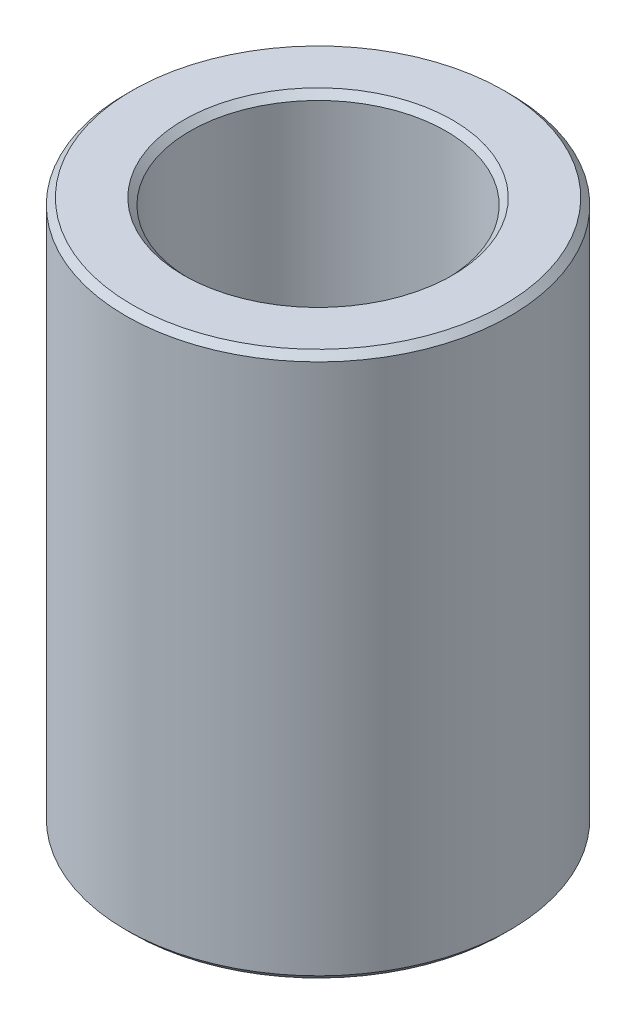
ISO-10303-21;
HEADER;
FILE_DESCRIPTION(('STEP AP214'),'2;1');
FILE_NAME('part.step','',(''),(''),'','','');
FILE_SCHEMA(('AUTOMOTIVE_DESIGN { 1 0 10303 214 1 1 1 1 }'));
ENDSEC;
DATA;
#1=APPLICATION_CONTEXT('core data for automotive mechanical design processes');
#2=APPLICATION_PROTOCOL_DEFINITION('international standard','automotive_design',2000,#1);
#3=PRODUCT_CONTEXT('',#1,'mechanical');
#4=PRODUCT('Part','Part','',(#3));
#5=PRODUCT_RELATED_PRODUCT_CATEGORY('part','',(#4));
#6=PRODUCT_DEFINITION_FORMATION('','',#4);
#7=PRODUCT_DEFINITION_CONTEXT('part definition',#1,'design');
#8=PRODUCT_DEFINITION('design','',#6,#7);
#9=PRODUCT_DEFINITION_SHAPE('','',#8);
#10=(LENGTH_UNIT() NAMED_UNIT(*) SI_UNIT(.MILLI.,.METRE.));
#11=(NAMED_UNIT(*) PLANE_ANGLE_UNIT() SI_UNIT($,.RADIAN.));
#12=(NAMED_UNIT(*) SI_UNIT($,.STERADIAN.) SOLID_ANGLE_UNIT());
#13=UNCERTAINTY_MEASURE_WITH_UNIT(LENGTH_MEASURE(1.E-05),#10,'distance_accuracy_value','');
#14=(GEOMETRIC_REPRESENTATION_CONTEXT(3) GLOBAL_UNCERTAINTY_ASSIGNED_CONTEXT((#13)) GLOBAL_UNIT_ASSIGNED_CONTEXT((#10,
#11,#12)) REPRESENTATION_CONTEXT('',''));
#15=CARTESIAN_POINT('',(0.,0.,0.));
#16=DIRECTION('',(0.,0.,1.));
#17=DIRECTION('',(1.,0.,0.));
#18=AXIS2_PLACEMENT_3D('',#15,#16,#17);
#19=CARTESIAN_POINT('',(0.,17.,0.));
#20=DIRECTION('',(0.,1.,0.));
#21=DIRECTION('',(0.,0.,1.));
#22=AXIS2_PLACEMENT_3D('',#19,#20,#21);
#23=PLANE('',#22);
#24=CARTESIAN_POINT('',(0.,17.,0.));
#25=DIRECTION('',(0.,1.,0.));
#26=DIRECTION('',(0.,0.,1.));
#27=AXIS2_PLACEMENT_3D('',#24,#25,#26);
#28=CIRCLE('',#27,5.8);
#29=CARTESIAN_POINT('',(0.,17.,5.8));
#30=VERTEX_POINT('',#29);
#31=EDGE_CURVE('E41',#30,#30,#28,.T.);
#32=ORIENTED_EDGE('',*,*,#31,.T.);
#33=EDGE_LOOP('',(#32));
#34=FACE_BOUND('',#33,.T.);
#35=CARTESIAN_POINT('',(0.,17.,0.));
#36=DIRECTION('',(0.,1.,0.));
#37=DIRECTION('',(0.,0.,1.));
#38=AXIS2_PLACEMENT_3D('',#35,#36,#37);
#39=CIRCLE('',#38,4.2);
#40=CARTESIAN_POINT('',(0.,17.,4.2));
#41=VERTEX_POINT('',#40);
#42=EDGE_CURVE('E45',#41,#41,#39,.F.);
#43=ORIENTED_EDGE('',*,*,#42,.T.);
#44=EDGE_LOOP('',(#43));
#45=FACE_BOUND('',#44,.T.);
#46=ADVANCED_FACE('F30',(#34,#45),#23,.T.);
#47=CARTESIAN_POINT('',(0.,0.,0.));
#48=DIRECTION('',(0.,1.,0.));
#49=DIRECTION('',(0.,0.,1.));
#50=AXIS2_PLACEMENT_3D('',#47,#48,#49);
#51=PLANE('',#50);
#52=CARTESIAN_POINT('',(0.,0.,0.));
#53=DIRECTION('',(0.,1.,0.));
#54=DIRECTION('',(0.,0.,1.));
#55=AXIS2_PLACEMENT_3D('',#52,#53,#54);
#56=CIRCLE('',#55,5.8);
#57=CARTESIAN_POINT('',(0.,0.,5.8));
#58=VERTEX_POINT('',#57);
#59=EDGE_CURVE('E50',#58,#58,#56,.F.);
#60=ORIENTED_EDGE('',*,*,#59,.T.);
#61=EDGE_LOOP('',(#60));
#62=FACE_BOUND('',#61,.T.);
#63=CARTESIAN_POINT('',(0.,0.,0.));
#64=DIRECTION('',(0.,1.,0.));
#65=DIRECTION('',(0.,0.,1.));
#66=AXIS2_PLACEMENT_3D('',#63,#64,#65);
#67=CIRCLE('',#66,4.2);
#68=CARTESIAN_POINT('',(0.,0.,4.2));
#69=VERTEX_POINT('',#68);
#70=EDGE_CURVE('E53',#69,#69,#67,.T.);
#71=ORIENTED_EDGE('',*,*,#70,.T.);
#72=EDGE_LOOP('',(#71));
#73=FACE_BOUND('',#72,.T.);
#74=ADVANCED_FACE('F75',(#62,#73),#51,.F.);
#75=CARTESIAN_POINT('',(0.,17.,0.));
#76=DIRECTION('',(0.,-1.,0.));
#77=DIRECTION('',(0.,0.,-1.));
#78=AXIS2_PLACEMENT_3D('',#75,#76,#77);
#79=CYLINDRICAL_SURFACE('',#78,6.);
#80=CARTESIAN_POINT('',(0.,0.199999999999999,0.));
#81=DIRECTION('',(0.,1.,0.));
#82=DIRECTION('',(0.,0.,1.));
#83=AXIS2_PLACEMENT_3D('',#80,#81,#82);
#84=CIRCLE('',#83,6.);
#85=CARTESIAN_POINT('',(0.,0.199999999999999,6.));
#86=VERTEX_POINT('',#85);
#87=EDGE_CURVE('E56',#86,#86,#84,.T.);
#88=ORIENTED_EDGE('',*,*,#87,.T.);
#89=EDGE_LOOP('',(#88));
#90=FACE_BOUND('',#89,.T.);
#91=CARTESIAN_POINT('',(0.,16.8,0.));
#92=DIRECTION('',(0.,1.,0.));
#93=DIRECTION('',(0.,0.,1.));
#94=AXIS2_PLACEMENT_3D('',#91,#92,#93);
#95=CIRCLE('',#94,6.);
#96=CARTESIAN_POINT('',(0.,16.8,6.));
#97=VERTEX_POINT('',#96);
#98=EDGE_CURVE('E59',#97,#97,#95,.F.);
#99=ORIENTED_EDGE('',*,*,#98,.T.);
#100=EDGE_LOOP('',(#99));
#101=FACE_BOUND('',#100,.T.);
#102=ADVANCED_FACE('F63',(#90,#101),#79,.T.);
#103=CARTESIAN_POINT('',(0.,17.,0.));
#104=DIRECTION('',(0.,-1.,0.));
#105=DIRECTION('',(0.,0.,-1.));
#106=AXIS2_PLACEMENT_3D('',#103,#104,#105);
#107=CYLINDRICAL_SURFACE('',#106,4.);
#108=CARTESIAN_POINT('',(0.,0.199999999999999,0.));
#109=DIRECTION('',(0.,1.,0.));
#110=DIRECTION('',(0.,0.,1.));
#111=AXIS2_PLACEMENT_3D('',#108,#109,#110);
#112=CIRCLE('',#111,4.);
#113=CARTESIAN_POINT('',(0.,0.199999999999999,4.));
#114=VERTEX_POINT('',#113);
#115=EDGE_CURVE('E10',#114,#114,#112,.F.);
#116=ORIENTED_EDGE('',*,*,#115,.T.);
#117=EDGE_LOOP('',(#116));
#118=FACE_BOUND('',#117,.T.);
#119=CARTESIAN_POINT('',(0.,16.8,0.));
#120=DIRECTION('',(0.,1.,0.));
#121=DIRECTION('',(0.,0.,1.));
#122=AXIS2_PLACEMENT_3D('',#119,#120,#121);
#123=CIRCLE('',#122,4.);
#124=CARTESIAN_POINT('',(0.,16.8,4.));
#125=VERTEX_POINT('',#124);
#126=EDGE_CURVE('E37',#125,#125,#123,.T.);
#127=ORIENTED_EDGE('',*,*,#126,.T.);
#128=EDGE_LOOP('',(#127));
#129=FACE_BOUND('',#128,.T.);
#130=ADVANCED_FACE('F91',(#118,#129),#107,.F.);
#131=CARTESIAN_POINT('',(0.,0.199999999999999,0.));
#132=DIRECTION('',(0.,1.,0.));
#133=DIRECTION('',(0.,0.,1.));
#134=AXIS2_PLACEMENT_3D('',#131,#132,#133);
#135=CONICAL_SURFACE('',#134,6.,0.785398163397444);
#136=ORIENTED_EDGE('',*,*,#59,.F.);
#137=EDGE_LOOP('',(#136));
#138=FACE_BOUND('',#137,.T.);
#139=ORIENTED_EDGE('',*,*,#87,.F.);
#140=EDGE_LOOP('',(#139));
#141=FACE_BOUND('',#140,.T.);
#142=ADVANCED_FACE('F69',(#138,#141),#135,.T.);
#143=CARTESIAN_POINT('',(0.,17.,0.));
#144=DIRECTION('',(0.,-1.,0.));
#145=DIRECTION('',(0.,0.,-1.));
#146=AXIS2_PLACEMENT_3D('',#143,#144,#145);
#147=CONICAL_SURFACE('',#146,5.8,0.785398163397457);
#148=ORIENTED_EDGE('',*,*,#98,.F.);
#149=EDGE_LOOP('',(#148));
#150=FACE_BOUND('',#149,.T.);
#151=ORIENTED_EDGE('',*,*,#31,.F.);
#152=EDGE_LOOP('',(#151));
#153=FACE_BOUND('',#152,.T.);
#154=ADVANCED_FACE('F65',(#150,#153),#147,.T.);
#155=CARTESIAN_POINT('',(0.,0.,0.));
#156=DIRECTION('',(0.,-1.,0.));
#157=DIRECTION('',(0.,0.,-1.));
#158=AXIS2_PLACEMENT_3D('',#155,#156,#157);
#159=CONICAL_SURFACE('',#158,4.2,0.785398163397448);
#160=ORIENTED_EDGE('',*,*,#115,.F.);
#161=EDGE_LOOP('',(#160));
#162=FACE_BOUND('',#161,.T.);
#163=ORIENTED_EDGE('',*,*,#70,.F.);
#164=EDGE_LOOP('',(#163));
#165=FACE_BOUND('',#164,.T.);
#166=ADVANCED_FACE('F68',(#162,#165),#159,.F.);
#167=CARTESIAN_POINT('',(0.,16.8,0.));
#168=DIRECTION('',(0.,1.,0.));
#169=DIRECTION('',(0.,0.,1.));
#170=AXIS2_PLACEMENT_3D('',#167,#168,#169);
#171=CONICAL_SURFACE('',#170,4.,0.785398163397448);
#172=ORIENTED_EDGE('',*,*,#42,.F.);
#173=EDGE_LOOP('',(#172));
#174=FACE_BOUND('',#173,.T.);
#175=ORIENTED_EDGE('',*,*,#126,.F.);
#176=EDGE_LOOP('',(#175));
#177=FACE_BOUND('',#176,.T.);
#178=ADVANCED_FACE('F32',(#174,#177),#171,.F.);
#179=CLOSED_SHELL('',(#46,#74,#102,#130,#142,#154,#166,#178));
#180=MANIFOLD_SOLID_BREP('B2',#179);
#181=ADVANCED_BREP_SHAPE_REPRESENTATION('',(#18,#180),#14);
#182=SHAPE_DEFINITION_REPRESENTATION(#9,#181);
ENDSEC;
END-ISO-10303-21;
